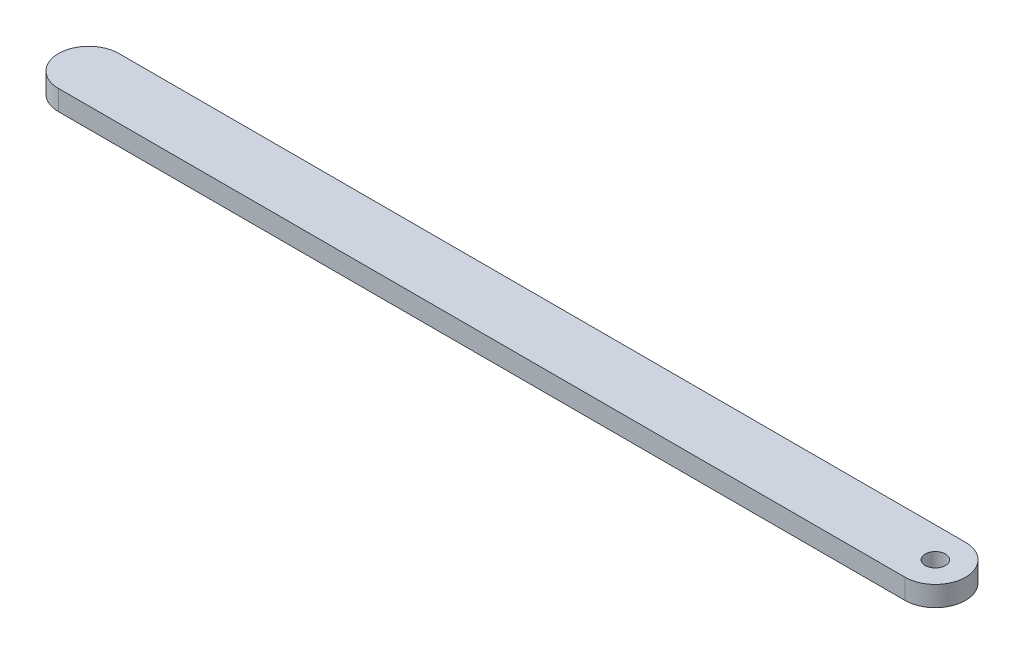
ISO-10303-21;
HEADER;
FILE_DESCRIPTION(('STEP AP214'),'2;1');
FILE_NAME('part.step','',(''),(''),'','','');
FILE_SCHEMA(('AUTOMOTIVE_DESIGN { 1 0 10303 214 1 1 1 1 }'));
ENDSEC;
DATA;
#1=APPLICATION_CONTEXT('core data for automotive mechanical design processes');
#2=APPLICATION_PROTOCOL_DEFINITION('international standard','automotive_design',2000,#1);
#3=PRODUCT_CONTEXT('',#1,'mechanical');
#4=PRODUCT('Part','Part','',(#3));
#5=PRODUCT_RELATED_PRODUCT_CATEGORY('part','',(#4));
#6=PRODUCT_DEFINITION_FORMATION('','',#4);
#7=PRODUCT_DEFINITION_CONTEXT('part definition',#1,'design');
#8=PRODUCT_DEFINITION('design','',#6,#7);
#9=PRODUCT_DEFINITION_SHAPE('','',#8);
#10=(LENGTH_UNIT() NAMED_UNIT(*) SI_UNIT(.MILLI.,.METRE.));
#11=(NAMED_UNIT(*) PLANE_ANGLE_UNIT() SI_UNIT($,.RADIAN.));
#12=(NAMED_UNIT(*) SI_UNIT($,.STERADIAN.) SOLID_ANGLE_UNIT());
#13=UNCERTAINTY_MEASURE_WITH_UNIT(LENGTH_MEASURE(1.E-05),#10,'distance_accuracy_value','');
#14=(GEOMETRIC_REPRESENTATION_CONTEXT(3) GLOBAL_UNCERTAINTY_ASSIGNED_CONTEXT((#13)) GLOBAL_UNIT_ASSIGNED_CONTEXT((#10,
#11,#12)) REPRESENTATION_CONTEXT('',''));
#15=CARTESIAN_POINT('',(0.,0.,0.));
#16=DIRECTION('',(0.,0.,1.));
#17=DIRECTION('',(1.,0.,0.));
#18=AXIS2_PLACEMENT_3D('',#15,#16,#17);
#19=CARTESIAN_POINT('',(-53.34,0.,0.));
#20=DIRECTION('',(0.,-1.,0.));
#21=DIRECTION('',(0.,0.,-1.));
#22=AXIS2_PLACEMENT_3D('',#19,#20,#21);
#23=CYLINDRICAL_SURFACE('',#22,3.81);
#24=DIRECTION('',(0.,-1.,0.));
#25=VECTOR('',#24,1.);
#26=CARTESIAN_POINT('',(-53.34,2.54,-3.81));
#27=LINE('',#26,#25);
#28=CARTESIAN_POINT('',(-53.34,0.,-3.81));
#29=VERTEX_POINT('',#28);
#30=CARTESIAN_POINT('',(-53.34,2.54,-3.81));
#31=VERTEX_POINT('',#30);
#32=EDGE_CURVE('E103',#29,#31,#27,.F.);
#33=ORIENTED_EDGE('',*,*,#32,.F.);
#34=CARTESIAN_POINT('',(-53.34,0.,0.));
#35=DIRECTION('',(0.,-1.,0.));
#36=DIRECTION('',(0.,0.,-1.));
#37=AXIS2_PLACEMENT_3D('',#34,#35,#36);
#38=CIRCLE('',#37,3.81);
#39=CARTESIAN_POINT('',(-53.34,0.,3.81));
#40=VERTEX_POINT('',#39);
#41=EDGE_CURVE('E43',#40,#29,#38,.T.);
#42=ORIENTED_EDGE('',*,*,#41,.F.);
#43=DIRECTION('',(0.,-1.,0.));
#44=VECTOR('',#43,1.);
#45=CARTESIAN_POINT('',(-53.34,2.54,3.81));
#46=LINE('',#45,#44);
#47=CARTESIAN_POINT('',(-53.34,2.54,3.81));
#48=VERTEX_POINT('',#47);
#49=EDGE_CURVE('E79',#48,#40,#46,.T.);
#50=ORIENTED_EDGE('',*,*,#49,.F.);
#51=CARTESIAN_POINT('',(-53.34,2.54,0.));
#52=DIRECTION('',(0.,-1.,0.));
#53=DIRECTION('',(0.,0.,-1.));
#54=AXIS2_PLACEMENT_3D('',#51,#52,#53);
#55=CIRCLE('',#54,3.81);
#56=EDGE_CURVE('E11',#31,#48,#55,.F.);
#57=ORIENTED_EDGE('',*,*,#56,.F.);
#58=EDGE_LOOP('',(#33,#42,#50,#57));
#59=FACE_BOUND('',#58,.T.);
#60=ADVANCED_FACE('F35',(#59),#23,.T.);
#61=CARTESIAN_POINT('',(53.34,0.,0.));
#62=DIRECTION('',(0.,-1.,0.));
#63=DIRECTION('',(0.,0.,-1.));
#64=AXIS2_PLACEMENT_3D('',#61,#62,#63);
#65=CYLINDRICAL_SURFACE('',#64,3.81);
#66=DIRECTION('',(0.,-1.,0.));
#67=VECTOR('',#66,1.);
#68=CARTESIAN_POINT('',(53.34,2.54,3.81));
#69=LINE('',#68,#67);
#70=CARTESIAN_POINT('',(53.34,0.,3.81));
#71=VERTEX_POINT('',#70);
#72=CARTESIAN_POINT('',(53.34,2.54,3.81));
#73=VERTEX_POINT('',#72);
#74=EDGE_CURVE('E78',#71,#73,#69,.F.);
#75=ORIENTED_EDGE('',*,*,#74,.F.);
#76=CARTESIAN_POINT('',(53.34,0.,0.));
#77=DIRECTION('',(0.,-1.,0.));
#78=DIRECTION('',(0.,0.,-1.));
#79=AXIS2_PLACEMENT_3D('',#76,#77,#78);
#80=CIRCLE('',#79,3.81);
#81=CARTESIAN_POINT('',(53.34,0.,-3.81));
#82=VERTEX_POINT('',#81);
#83=EDGE_CURVE('E85',#82,#71,#80,.T.);
#84=ORIENTED_EDGE('',*,*,#83,.F.);
#85=DIRECTION('',(0.,-1.,0.));
#86=VECTOR('',#85,1.);
#87=CARTESIAN_POINT('',(53.34,2.54,-3.81));
#88=LINE('',#87,#86);
#89=CARTESIAN_POINT('',(53.34,2.54,-3.81));
#90=VERTEX_POINT('',#89);
#91=EDGE_CURVE('E92',#90,#82,#88,.T.);
#92=ORIENTED_EDGE('',*,*,#91,.F.);
#93=CARTESIAN_POINT('',(53.34,2.54,0.));
#94=DIRECTION('',(0.,-1.,0.));
#95=DIRECTION('',(0.,0.,-1.));
#96=AXIS2_PLACEMENT_3D('',#93,#94,#95);
#97=CIRCLE('',#96,3.81);
#98=EDGE_CURVE('E91',#73,#90,#97,.F.);
#99=ORIENTED_EDGE('',*,*,#98,.F.);
#100=EDGE_LOOP('',(#75,#84,#92,#99));
#101=FACE_BOUND('',#100,.T.);
#102=ADVANCED_FACE('F95',(#101),#65,.T.);
#103=CARTESIAN_POINT('',(-57.15,2.54,-3.81));
#104=DIRECTION('',(0.,0.,1.));
#105=DIRECTION('',(1.,0.,0.));
#106=AXIS2_PLACEMENT_3D('',#103,#104,#105);
#107=PLANE('',#106);
#108=DIRECTION('',(-1.,0.,0.));
#109=VECTOR('',#108,1.);
#110=CARTESIAN_POINT('',(-57.15,0.,-3.81));
#111=LINE('',#110,#109);
#112=EDGE_CURVE('E82',#82,#29,#111,.T.);
#113=ORIENTED_EDGE('',*,*,#112,.T.);
#114=ORIENTED_EDGE('',*,*,#32,.T.);
#115=DIRECTION('',(-1.,0.,0.));
#116=VECTOR('',#115,1.);
#117=CARTESIAN_POINT('',(-57.15,2.54,-3.81));
#118=LINE('',#117,#116);
#119=EDGE_CURVE('E81',#90,#31,#118,.T.);
#120=ORIENTED_EDGE('',*,*,#119,.F.);
#121=ORIENTED_EDGE('',*,*,#91,.T.);
#122=EDGE_LOOP('',(#113,#114,#120,#121));
#123=FACE_BOUND('',#122,.T.);
#124=ADVANCED_FACE('F108',(#123),#107,.F.);
#125=CARTESIAN_POINT('',(-57.15,2.54,3.81));
#126=DIRECTION('',(0.,0.,-1.));
#127=DIRECTION('',(-1.,0.,0.));
#128=AXIS2_PLACEMENT_3D('',#125,#126,#127);
#129=PLANE('',#128);
#130=DIRECTION('',(1.,0.,0.));
#131=VECTOR('',#130,1.);
#132=CARTESIAN_POINT('',(-57.15,2.54,3.81));
#133=LINE('',#132,#131);
#134=EDGE_CURVE('E96',#48,#73,#133,.T.);
#135=ORIENTED_EDGE('',*,*,#134,.F.);
#136=ORIENTED_EDGE('',*,*,#49,.T.);
#137=DIRECTION('',(1.,0.,0.));
#138=VECTOR('',#137,1.);
#139=CARTESIAN_POINT('',(-57.15,0.,3.81));
#140=LINE('',#139,#138);
#141=EDGE_CURVE('E73',#40,#71,#140,.T.);
#142=ORIENTED_EDGE('',*,*,#141,.T.);
#143=ORIENTED_EDGE('',*,*,#74,.T.);
#144=EDGE_LOOP('',(#135,#136,#142,#143));
#145=FACE_BOUND('',#144,.T.);
#146=ADVANCED_FACE('F76',(#145),#129,.F.);
#147=CARTESIAN_POINT('',(0.,2.54,0.));
#148=DIRECTION('',(0.,-1.,0.));
#149=DIRECTION('',(0.,0.,-1.));
#150=AXIS2_PLACEMENT_3D('',#147,#148,#149);
#151=PLANE('',#150);
#152=CARTESIAN_POINT('',(53.34,2.54,0.));
#153=DIRECTION('',(0.,-1.,0.));
#154=DIRECTION('',(0.,0.,-1.));
#155=AXIS2_PLACEMENT_3D('',#152,#153,#154);
#156=CIRCLE('',#155,1.27);
#157=CARTESIAN_POINT('',(53.34,2.54,-1.27));
#158=VERTEX_POINT('',#157);
#159=EDGE_CURVE('E109',#158,#158,#156,.T.);
#160=ORIENTED_EDGE('',*,*,#159,.T.);
#161=EDGE_LOOP('',(#160));
#162=FACE_BOUND('',#161,.T.);
#163=ORIENTED_EDGE('',*,*,#119,.T.);
#164=ORIENTED_EDGE('',*,*,#56,.T.);
#165=ORIENTED_EDGE('',*,*,#134,.T.);
#166=ORIENTED_EDGE('',*,*,#98,.T.);
#167=EDGE_LOOP('',(#163,#164,#165,#166));
#168=FACE_BOUND('',#167,.T.);
#169=ADVANCED_FACE('F135',(#162,#168),#151,.F.);
#170=CARTESIAN_POINT('',(0.,0.,0.));
#171=DIRECTION('',(0.,-1.,0.));
#172=DIRECTION('',(0.,0.,-1.));
#173=AXIS2_PLACEMENT_3D('',#170,#171,#172);
#174=PLANE('',#173);
#175=CARTESIAN_POINT('',(-53.2345461082548,0.,0.));
#176=DIRECTION('',(0.,-1.,0.));
#177=DIRECTION('',(0.,0.,-1.));
#178=AXIS2_PLACEMENT_3D('',#175,#176,#177);
#179=CIRCLE('',#178,0.761999999999996);
#180=CARTESIAN_POINT('',(-53.2345461082548,0.,-0.761999999999996));
#181=VERTEX_POINT('',#180);
#182=EDGE_CURVE('E118',#181,#181,#179,.T.);
#183=ORIENTED_EDGE('',*,*,#182,.F.);
#184=EDGE_LOOP('',(#183));
#185=FACE_BOUND('',#184,.T.);
#186=CARTESIAN_POINT('',(53.34,0.,0.));
#187=DIRECTION('',(0.,-1.,0.));
#188=DIRECTION('',(0.,0.,-1.));
#189=AXIS2_PLACEMENT_3D('',#186,#187,#188);
#190=CIRCLE('',#189,1.27);
#191=CARTESIAN_POINT('',(53.34,0.,-1.27));
#192=VERTEX_POINT('',#191);
#193=EDGE_CURVE('E111',#192,#192,#190,.T.);
#194=ORIENTED_EDGE('',*,*,#193,.F.);
#195=EDGE_LOOP('',(#194));
#196=FACE_BOUND('',#195,.T.);
#197=ORIENTED_EDGE('',*,*,#141,.F.);
#198=ORIENTED_EDGE('',*,*,#41,.T.);
#199=ORIENTED_EDGE('',*,*,#112,.F.);
#200=ORIENTED_EDGE('',*,*,#83,.T.);
#201=EDGE_LOOP('',(#197,#198,#199,#200));
#202=FACE_BOUND('',#201,.T.);
#203=ADVANCED_FACE('F86',(#185,#196,#202),#174,.T.);
#204=CARTESIAN_POINT('',(53.34,2.54,0.));
#205=DIRECTION('',(0.,-1.,0.));
#206=DIRECTION('',(0.,0.,-1.));
#207=AXIS2_PLACEMENT_3D('',#204,#205,#206);
#208=CYLINDRICAL_SURFACE('',#207,1.27);
#209=ORIENTED_EDGE('',*,*,#159,.F.);
#210=EDGE_LOOP('',(#209));
#211=FACE_BOUND('',#210,.T.);
#212=ORIENTED_EDGE('',*,*,#193,.T.);
#213=EDGE_LOOP('',(#212));
#214=FACE_BOUND('',#213,.T.);
#215=ADVANCED_FACE('F129',(#211,#214),#208,.F.);
#216=CARTESIAN_POINT('',(-53.2345461082548,-2.54,0.));
#217=DIRECTION('',(0.,1.,0.));
#218=DIRECTION('',(0.,0.,1.));
#219=AXIS2_PLACEMENT_3D('',#216,#217,#218);
#220=CYLINDRICAL_SURFACE('',#219,0.761999999999996);
#221=CARTESIAN_POINT('',(-53.2345461082548,-2.54,0.));
#222=DIRECTION('',(0.,-1.,0.));
#223=DIRECTION('',(0.,0.,-1.));
#224=AXIS2_PLACEMENT_3D('',#221,#222,#223);
#225=CIRCLE('',#224,0.761999999999996);
#226=CARTESIAN_POINT('',(-53.2345461082548,-2.54,-0.761999999999996));
#227=VERTEX_POINT('',#226);
#228=EDGE_CURVE('E116',#227,#227,#225,.T.);
#229=ORIENTED_EDGE('',*,*,#228,.F.);
#230=EDGE_LOOP('',(#229));
#231=FACE_BOUND('',#230,.T.);
#232=ORIENTED_EDGE('',*,*,#182,.T.);
#233=EDGE_LOOP('',(#232));
#234=FACE_BOUND('',#233,.T.);
#235=ADVANCED_FACE('F126',(#231,#234),#220,.T.);
#236=CARTESIAN_POINT('',(-53.2345461082548,-2.54,0.));
#237=DIRECTION('',(0.,-1.,0.));
#238=DIRECTION('',(0.,0.,-1.));
#239=AXIS2_PLACEMENT_3D('',#236,#237,#238);
#240=PLANE('',#239);
#241=ORIENTED_EDGE('',*,*,#228,.T.);
#242=EDGE_LOOP('',(#241));
#243=FACE_BOUND('',#242,.T.);
#244=ADVANCED_FACE('F124',(#243),#240,.T.);
#245=CLOSED_SHELL('',(#60,#102,#124,#146,#169,#203,#215,#235,#244));
#246=MANIFOLD_SOLID_BREP('B2',#245);
#247=ADVANCED_BREP_SHAPE_REPRESENTATION('',(#18,#246),#14);
#248=SHAPE_DEFINITION_REPRESENTATION(#9,#247);
ENDSEC;
END-ISO-10303-21;
